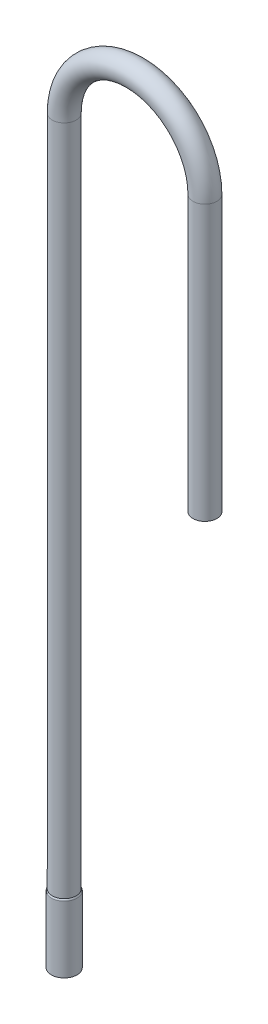
ISO-10303-21;
HEADER;
FILE_DESCRIPTION(('STEP AP214'),'2;1');
FILE_NAME('part.step','',(''),(''),'','','');
FILE_SCHEMA(('AUTOMOTIVE_DESIGN { 1 0 10303 214 1 1 1 1 }'));
ENDSEC;
DATA;
#1=APPLICATION_CONTEXT('core data for automotive mechanical design processes');
#2=APPLICATION_PROTOCOL_DEFINITION('international standard','automotive_design',2000,#1);
#3=PRODUCT_CONTEXT('',#1,'mechanical');
#4=PRODUCT('Part','Part','',(#3));
#5=PRODUCT_RELATED_PRODUCT_CATEGORY('part','',(#4));
#6=PRODUCT_DEFINITION_FORMATION('','',#4);
#7=PRODUCT_DEFINITION_CONTEXT('part definition',#1,'design');
#8=PRODUCT_DEFINITION('design','',#6,#7);
#9=PRODUCT_DEFINITION_SHAPE('','',#8);
#10=(LENGTH_UNIT() NAMED_UNIT(*) SI_UNIT(.MILLI.,.METRE.));
#11=(NAMED_UNIT(*) PLANE_ANGLE_UNIT() SI_UNIT($,.RADIAN.));
#12=(NAMED_UNIT(*) SI_UNIT($,.STERADIAN.) SOLID_ANGLE_UNIT());
#13=UNCERTAINTY_MEASURE_WITH_UNIT(LENGTH_MEASURE(1.E-05),#10,'distance_accuracy_value','');
#14=(GEOMETRIC_REPRESENTATION_CONTEXT(3) GLOBAL_UNCERTAINTY_ASSIGNED_CONTEXT((#13)) GLOBAL_UNIT_ASSIGNED_CONTEXT((#10,
#11,#12)) REPRESENTATION_CONTEXT('',''));
#15=CARTESIAN_POINT('',(0.,0.,0.));
#16=DIRECTION('',(0.,0.,1.));
#17=DIRECTION('',(1.,0.,0.));
#18=AXIS2_PLACEMENT_3D('',#15,#16,#17);
#19=CARTESIAN_POINT('',(0.,13.335,0.));
#20=DIRECTION('',(0.,-1.,0.));
#21=DIRECTION('',(0.,0.,1.));
#22=AXIS2_PLACEMENT_3D('',#19,#20,#21);
#23=PLANE('',#22);
#24=CARTESIAN_POINT('',(0.,13.335,0.));
#25=DIRECTION('',(0.,-1.,0.));
#26=DIRECTION('',(0.,0.,1.));
#27=AXIS2_PLACEMENT_3D('',#24,#25,#26);
#28=CIRCLE('',#27,5.57000000000001);
#29=CARTESIAN_POINT('',(0.,13.335,5.57000000000001));
#30=VERTEX_POINT('',#29);
#31=EDGE_CURVE('E86',#30,#30,#28,.T.);
#32=ORIENTED_EDGE('',*,*,#31,.F.);
#33=EDGE_LOOP('',(#32));
#34=FACE_BOUND('',#33,.T.);
#35=CARTESIAN_POINT('',(0.,13.335,0.));
#36=DIRECTION('',(0.,-1.,0.));
#37=DIRECTION('',(1.,0.,0.));
#38=AXIS2_PLACEMENT_3D('',#35,#36,#37);
#39=CIRCLE('',#38,5.97000000000001);
#40=CARTESIAN_POINT('',(5.97000000000001,13.335,0.));
#41=VERTEX_POINT('',#40);
#42=EDGE_CURVE('E77',#41,#41,#39,.T.);
#43=ORIENTED_EDGE('',*,*,#42,.T.);
#44=EDGE_LOOP('',(#43));
#45=FACE_BOUND('',#44,.T.);
#46=ADVANCED_FACE('F60',(#34,#45),#23,.T.);
#47=CARTESIAN_POINT('',(0.,13.335,0.));
#48=DIRECTION('',(0.,1.,0.));
#49=DIRECTION('',(0.,0.,1.));
#50=AXIS2_PLACEMENT_3D('',#47,#48,#49);
#51=CYLINDRICAL_SURFACE('',#50,5.97000000000001);
#52=CARTESIAN_POINT('',(0.,150.,0.));
#53=DIRECTION('',(0.,1.,0.));
#54=DIRECTION('',(0.,0.,1.));
#55=AXIS2_PLACEMENT_3D('',#52,#53,#54);
#56=CIRCLE('',#55,5.97000000000001);
#57=CARTESIAN_POINT('',(5.97,150.,0.));
#58=VERTEX_POINT('',#57);
#59=EDGE_CURVE('E69',#58,#58,#56,.F.);
#60=ORIENTED_EDGE('',*,*,#59,.T.);
#61=EDGE_LOOP('',(#60));
#62=FACE_BOUND('',#61,.T.);
#63=ORIENTED_EDGE('',*,*,#42,.F.);
#64=EDGE_LOOP('',(#63));
#65=FACE_BOUND('',#64,.T.);
#66=ADVANCED_FACE('F137',(#62,#65),#51,.T.);
#67=CARTESIAN_POINT('',(-35.,150.,0.));
#68=DIRECTION('',(0.,0.,1.));
#69=DIRECTION('',(1.,0.,0.));
#70=AXIS2_PLACEMENT_3D('',#67,#68,#69);
#71=TOROIDAL_SURFACE('',#70,35.,5.97000000000001);
#72=CARTESIAN_POINT('',(-70.,150.,0.));
#73=DIRECTION('',(0.,1.,0.));
#74=DIRECTION('',(-1.,0.,0.));
#75=AXIS2_PLACEMENT_3D('',#72,#73,#74);
#76=CIRCLE('',#75,5.97000000000001);
#77=CARTESIAN_POINT('',(-75.97,150.,0.));
#78=VERTEX_POINT('',#77);
#79=EDGE_CURVE('E62',#78,#78,#76,.T.);
#80=CARTESIAN_POINT('',(-35.,150.,0.));
#81=DIRECTION('',(0.,0.,1.));
#82=DIRECTION('',(1.,0.,0.));
#83=AXIS2_PLACEMENT_3D('',#80,#81,#82);
#84=CIRCLE('',#83,40.97);
#85=EDGE_CURVE('',#58,#78,#84,.T.);
#86=ORIENTED_EDGE('',*,*,#59,.F.);
#87=ORIENTED_EDGE('',*,*,#79,.T.);
#88=ORIENTED_EDGE('',*,*,#85,.T.);
#89=ORIENTED_EDGE('',*,*,#85,.F.);
#90=EDGE_LOOP('',(#86,#88,#87,#89));
#91=FACE_BOUND('',#90,.T.);
#92=ADVANCED_FACE('F143',(#91),#71,.T.);
#93=CARTESIAN_POINT('',(-70.,150.,0.));
#94=DIRECTION('',(0.,-1.,0.));
#95=DIRECTION('',(1.,0.,0.));
#96=AXIS2_PLACEMENT_3D('',#93,#94,#95);
#97=CYLINDRICAL_SURFACE('',#96,5.97000000000001);
#98=CARTESIAN_POINT('',(-70.,-184.185,0.));
#99=DIRECTION('',(0.,1.,0.));
#100=DIRECTION('',(0.,0.,1.));
#101=AXIS2_PLACEMENT_3D('',#98,#99,#100);
#102=CIRCLE('',#101,5.97000000000001);
#103=CARTESIAN_POINT('',(-70.,-184.185,5.97000000000001));
#104=VERTEX_POINT('',#103);
#105=EDGE_CURVE('E85',#104,#104,#102,.T.);
#106=ORIENTED_EDGE('',*,*,#105,.T.);
#107=EDGE_LOOP('',(#106));
#108=FACE_BOUND('',#107,.T.);
#109=ORIENTED_EDGE('',*,*,#79,.F.);
#110=EDGE_LOOP('',(#109));
#111=FACE_BOUND('',#110,.T.);
#112=ADVANCED_FACE('F132',(#108,#111),#97,.T.);
#113=CARTESIAN_POINT('',(0.,13.335,0.));
#114=DIRECTION('',(0.,1.,0.));
#115=DIRECTION('',(0.,0.,1.));
#116=AXIS2_PLACEMENT_3D('',#113,#114,#115);
#117=CYLINDRICAL_SURFACE('',#116,5.57000000000001);
#118=CARTESIAN_POINT('',(0.,150.,0.));
#119=DIRECTION('',(0.,-1.,0.));
#120=DIRECTION('',(0.,0.,1.));
#121=AXIS2_PLACEMENT_3D('',#118,#119,#120);
#122=CIRCLE('',#121,5.57000000000001);
#123=CARTESIAN_POINT('',(5.57000000000001,150.,0.));
#124=VERTEX_POINT('',#123);
#125=EDGE_CURVE('E95',#124,#124,#122,.T.);
#126=ORIENTED_EDGE('',*,*,#125,.F.);
#127=EDGE_LOOP('',(#126));
#128=FACE_BOUND('',#127,.T.);
#129=ORIENTED_EDGE('',*,*,#31,.T.);
#130=EDGE_LOOP('',(#129));
#131=FACE_BOUND('',#130,.T.);
#132=ADVANCED_FACE('F130',(#128,#131),#117,.F.);
#133=CARTESIAN_POINT('',(-35.,150.,0.));
#134=DIRECTION('',(0.,0.,1.));
#135=DIRECTION('',(1.,0.,0.));
#136=AXIS2_PLACEMENT_3D('',#133,#134,#135);
#137=TOROIDAL_SURFACE('',#136,35.,5.57000000000001);
#138=CARTESIAN_POINT('',(-70.,150.,0.));
#139=DIRECTION('',(0.,1.,0.));
#140=DIRECTION('',(0.,0.,1.));
#141=AXIS2_PLACEMENT_3D('',#138,#139,#140);
#142=CIRCLE('',#141,5.57000000000001);
#143=CARTESIAN_POINT('',(-75.57,150.,0.));
#144=VERTEX_POINT('',#143);
#145=EDGE_CURVE('E107',#144,#144,#142,.T.);
#146=CARTESIAN_POINT('',(-35.,150.,0.));
#147=DIRECTION('',(0.,0.,1.));
#148=DIRECTION('',(1.,0.,0.));
#149=AXIS2_PLACEMENT_3D('',#146,#147,#148);
#150=CIRCLE('',#149,40.57);
#151=EDGE_CURVE('',#124,#144,#150,.T.);
#152=ORIENTED_EDGE('',*,*,#125,.T.);
#153=ORIENTED_EDGE('',*,*,#145,.F.);
#154=ORIENTED_EDGE('',*,*,#151,.T.);
#155=ORIENTED_EDGE('',*,*,#151,.F.);
#156=EDGE_LOOP('',(#152,#154,#153,#155));
#157=FACE_BOUND('',#156,.T.);
#158=ADVANCED_FACE('F125',(#157),#137,.F.);
#159=CARTESIAN_POINT('',(-70.,150.,0.));
#160=DIRECTION('',(0.,-1.,0.));
#161=DIRECTION('',(1.,0.,0.));
#162=AXIS2_PLACEMENT_3D('',#159,#160,#161);
#163=CYLINDRICAL_SURFACE('',#162,5.57000000000001);
#164=CARTESIAN_POINT('',(-70.,-184.185,0.));
#165=DIRECTION('',(0.,1.,0.));
#166=DIRECTION('',(0.,0.,1.));
#167=AXIS2_PLACEMENT_3D('',#164,#165,#166);
#168=CIRCLE('',#167,5.57000000000001);
#169=CARTESIAN_POINT('',(-70.,-184.185,5.57000000000001));
#170=VERTEX_POINT('',#169);
#171=EDGE_CURVE('E81',#170,#170,#168,.T.);
#172=ORIENTED_EDGE('',*,*,#171,.F.);
#173=EDGE_LOOP('',(#172));
#174=FACE_BOUND('',#173,.T.);
#175=ORIENTED_EDGE('',*,*,#145,.T.);
#176=EDGE_LOOP('',(#175));
#177=FACE_BOUND('',#176,.T.);
#178=ADVANCED_FACE('F118',(#174,#177),#163,.F.);
#179=CARTESIAN_POINT('',(-70.,-186.185,0.));
#180=DIRECTION('',(0.,1.,0.));
#181=DIRECTION('',(0.,0.,1.));
#182=AXIS2_PLACEMENT_3D('',#179,#180,#181);
#183=CONICAL_SURFACE('',#182,2.9082000542683,0.926418184070871);
#184=ORIENTED_EDGE('',*,*,#171,.T.);
#185=EDGE_LOOP('',(#184));
#186=FACE_BOUND('',#185,.T.);
#187=CARTESIAN_POINT('',(-70.,-186.185,0.));
#188=DIRECTION('',(0.,1.,0.));
#189=DIRECTION('',(0.,0.,1.));
#190=AXIS2_PLACEMENT_3D('',#187,#188,#189);
#191=CIRCLE('',#190,2.9082000542683);
#192=CARTESIAN_POINT('',(-70.,-186.185,2.9082000542683));
#193=VERTEX_POINT('',#192);
#194=EDGE_CURVE('E90',#193,#193,#191,.T.);
#195=ORIENTED_EDGE('',*,*,#194,.F.);
#196=EDGE_LOOP('',(#195));
#197=FACE_BOUND('',#196,.T.);
#198=ADVANCED_FACE('F116',(#186,#197),#183,.F.);
#199=CARTESIAN_POINT('',(-74.0239344982683,-186.185,0.));
#200=DIRECTION('',(0.,-1.,0.));
#201=DIRECTION('',(0.,0.,-1.));
#202=AXIS2_PLACEMENT_3D('',#199,#200,#201);
#203=PLANE('',#202);
#204=ORIENTED_EDGE('',*,*,#194,.T.);
#205=EDGE_LOOP('',(#204));
#206=FACE_BOUND('',#205,.T.);
#207=CARTESIAN_POINT('',(-70.,-186.185,0.));
#208=DIRECTION('',(0.,1.,0.));
#209=DIRECTION('',(0.,0.,1.));
#210=AXIS2_PLACEMENT_3D('',#207,#208,#209);
#211=CIRCLE('',#210,4.02393449826829);
#212=CARTESIAN_POINT('',(-70.,-186.185,4.02393449826829));
#213=VERTEX_POINT('',#212);
#214=EDGE_CURVE('E98',#213,#213,#211,.T.);
#215=ORIENTED_EDGE('',*,*,#214,.F.);
#216=EDGE_LOOP('',(#215));
#217=FACE_BOUND('',#216,.T.);
#218=ADVANCED_FACE('F179',(#206,#217),#203,.T.);
#219=CARTESIAN_POINT('',(-70.,-218.06,0.));
#220=DIRECTION('',(0.,-1.,0.));
#221=DIRECTION('',(0.,0.,-1.));
#222=AXIS2_PLACEMENT_3D('',#219,#220,#221);
#223=CONICAL_SURFACE('',#222,4.89181461455,0.0272208861509107);
#224=ORIENTED_EDGE('',*,*,#214,.T.);
#225=EDGE_LOOP('',(#224));
#226=FACE_BOUND('',#225,.T.);
#227=CARTESIAN_POINT('',(-70.,-218.06,0.));
#228=DIRECTION('',(0.,1.,0.));
#229=DIRECTION('',(0.,0.,1.));
#230=AXIS2_PLACEMENT_3D('',#227,#228,#229);
#231=CIRCLE('',#230,4.89181461455);
#232=CARTESIAN_POINT('',(-70.,-218.06,4.89181461455));
#233=VERTEX_POINT('',#232);
#234=EDGE_CURVE('E105',#233,#233,#231,.T.);
#235=ORIENTED_EDGE('',*,*,#234,.F.);
#236=EDGE_LOOP('',(#235));
#237=FACE_BOUND('',#236,.T.);
#238=ADVANCED_FACE('F189',(#226,#237),#223,.F.);
#239=CARTESIAN_POINT('',(-74.89181461455,-218.06,0.));
#240=DIRECTION('',(0.,-1.,0.));
#241=DIRECTION('',(0.,0.,-1.));
#242=AXIS2_PLACEMENT_3D('',#239,#240,#241);
#243=PLANE('',#242);
#244=ORIENTED_EDGE('',*,*,#234,.T.);
#245=EDGE_LOOP('',(#244));
#246=FACE_BOUND('',#245,.T.);
#247=CARTESIAN_POINT('',(-70.,-218.06,0.));
#248=DIRECTION('',(0.,1.,0.));
#249=DIRECTION('',(0.,0.,1.));
#250=AXIS2_PLACEMENT_3D('',#247,#248,#249);
#251=CIRCLE('',#250,6.37);
#252=CARTESIAN_POINT('',(-70.,-218.06,6.37));
#253=VERTEX_POINT('',#252);
#254=EDGE_CURVE('E255',#253,#253,#251,.T.);
#255=ORIENTED_EDGE('',*,*,#254,.F.);
#256=EDGE_LOOP('',(#255));
#257=FACE_BOUND('',#256,.T.);
#258=ADVANCED_FACE('F196',(#246,#257),#243,.T.);
#259=CARTESIAN_POINT('',(-70.,-184.185,0.));
#260=DIRECTION('',(0.,1.,0.));
#261=DIRECTION('',(0.,0.,1.));
#262=AXIS2_PLACEMENT_3D('',#259,#260,#261);
#263=CYLINDRICAL_SURFACE('',#262,6.37);
#264=CARTESIAN_POINT('',(-70.,-184.985,0.));
#265=DIRECTION('',(0.,1.,0.));
#266=DIRECTION('',(0.,0.,1.));
#267=AXIS2_PLACEMENT_3D('',#264,#265,#266);
#268=CIRCLE('',#267,6.37);
#269=CARTESIAN_POINT('',(-70.,-184.985,6.37));
#270=VERTEX_POINT('',#269);
#271=EDGE_CURVE('E11',#270,#270,#268,.F.);
#272=ORIENTED_EDGE('',*,*,#271,.T.);
#273=EDGE_LOOP('',(#272));
#274=FACE_BOUND('',#273,.T.);
#275=ORIENTED_EDGE('',*,*,#254,.T.);
#276=EDGE_LOOP('',(#275));
#277=FACE_BOUND('',#276,.T.);
#278=ADVANCED_FACE('F202',(#274,#277),#263,.T.);
#279=CARTESIAN_POINT('',(-70.,-184.985,0.));
#280=DIRECTION('',(0.,1.,0.));
#281=DIRECTION('',(0.,0.,1.));
#282=AXIS2_PLACEMENT_3D('',#279,#280,#281);
#283=TOROIDAL_SURFACE('',#282,5.37,1.);
#284=ORIENTED_EDGE('',*,*,#271,.F.);
#285=EDGE_LOOP('',(#284));
#286=FACE_BOUND('',#285,.T.);
#287=ORIENTED_EDGE('',*,*,#105,.F.);
#288=EDGE_LOOP('',(#287));
#289=FACE_BOUND('',#288,.T.);
#290=ADVANCED_FACE('F56',(#286,#289),#283,.T.);
#291=CLOSED_SHELL('',(#46,#66,#92,#112,#132,#158,#178,#198,#218,#238,#258,#278,#290));
#292=MANIFOLD_SOLID_BREP('B2',#291);
#293=ADVANCED_BREP_SHAPE_REPRESENTATION('',(#18,#292),#14);
#294=SHAPE_DEFINITION_REPRESENTATION(#9,#293);
ENDSEC;
END-ISO-10303-21;
